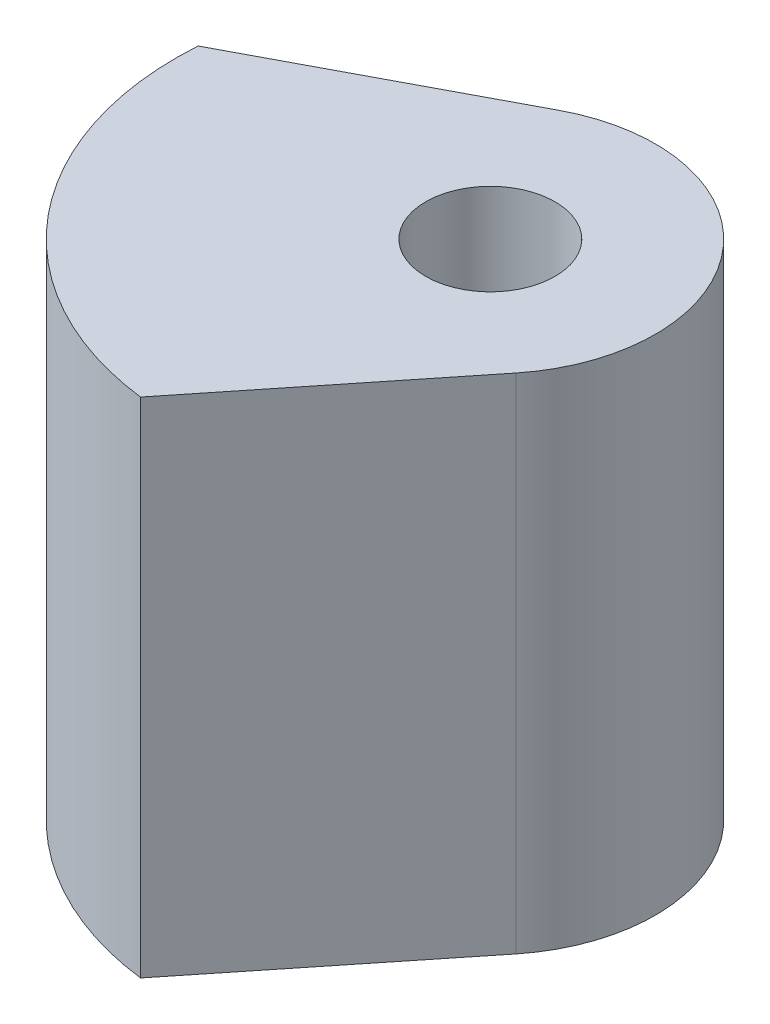
ISO-10303-21;
HEADER;
FILE_DESCRIPTION(('STEP AP214'),'2;1');
FILE_NAME('part.step','',(''),(''),'','','');
FILE_SCHEMA(('AUTOMOTIVE_DESIGN { 1 0 10303 214 1 1 1 1 }'));
ENDSEC;
DATA;
#1=APPLICATION_CONTEXT('core data for automotive mechanical design processes');
#2=APPLICATION_PROTOCOL_DEFINITION('international standard','automotive_design',2000,#1);
#3=PRODUCT_CONTEXT('',#1,'mechanical');
#4=PRODUCT('Part','Part','',(#3));
#5=PRODUCT_RELATED_PRODUCT_CATEGORY('part','',(#4));
#6=PRODUCT_DEFINITION_FORMATION('','',#4);
#7=PRODUCT_DEFINITION_CONTEXT('part definition',#1,'design');
#8=PRODUCT_DEFINITION('design','',#6,#7);
#9=PRODUCT_DEFINITION_SHAPE('','',#8);
#10=(LENGTH_UNIT() NAMED_UNIT(*) SI_UNIT(.MILLI.,.METRE.));
#11=(NAMED_UNIT(*) PLANE_ANGLE_UNIT() SI_UNIT($,.RADIAN.));
#12=(NAMED_UNIT(*) SI_UNIT($,.STERADIAN.) SOLID_ANGLE_UNIT());
#13=UNCERTAINTY_MEASURE_WITH_UNIT(LENGTH_MEASURE(1.E-05),#10,'distance_accuracy_value','');
#14=(GEOMETRIC_REPRESENTATION_CONTEXT(3) GLOBAL_UNCERTAINTY_ASSIGNED_CONTEXT((#13)) GLOBAL_UNIT_ASSIGNED_CONTEXT((#10,
#11,#12)) REPRESENTATION_CONTEXT('',''));
#15=CARTESIAN_POINT('',(0.,0.,0.));
#16=DIRECTION('',(0.,0.,1.));
#17=DIRECTION('',(1.,0.,0.));
#18=AXIS2_PLACEMENT_3D('',#15,#16,#17);
#19=CARTESIAN_POINT('',(-3.02691739141013,6.,0.615971894933232));
#20=DIRECTION('',(0.,1.,0.));
#21=DIRECTION('',(0.,0.,1.));
#22=AXIS2_PLACEMENT_3D('',#19,#20,#21);
#23=PLANE('',#22);
#24=CARTESIAN_POINT('',(-3.02691739141013,6.,0.615971894933232));
#25=DIRECTION('',(0.,1.,0.));
#26=DIRECTION('',(0.,0.,1.));
#27=AXIS2_PLACEMENT_3D('',#24,#25,#26);
#28=CIRCLE('',#27,1.96784902839059);
#29=CARTESIAN_POINT('',(-1.49051334675785,6.,1.84556223732939));
#30=VERTEX_POINT('',#29);
#31=CARTESIAN_POINT('',(-3.94609306967338,6.,-1.12401255069469));
#32=VERTEX_POINT('',#31);
#33=EDGE_CURVE('E85',#30,#32,#28,.T.);
#34=ORIENTED_EDGE('',*,*,#33,.T.);
#35=DIRECTION('',(-0.884206268125643,0.,0.467096644611502));
#36=VECTOR('',#35,1.);
#37=CARTESIAN_POINT('',(-3.94609306967338,6.,-1.12401255069469));
#38=LINE('',#37,#36);
#39=CARTESIAN_POINT('',(-6.76341973663373,6.,0.364287046752516));
#40=VERTEX_POINT('',#39);
#41=EDGE_CURVE('E80',#32,#40,#38,.T.);
#42=ORIENTED_EDGE('',*,*,#41,.T.);
#43=CARTESIAN_POINT('',(-3.02691739141013,6.,0.615971894933232));
#44=DIRECTION('',(0.,1.,0.));
#45=DIRECTION('',(0.,0.,1.));
#46=AXIS2_PLACEMENT_3D('',#43,#44,#45);
#47=CIRCLE('',#46,3.74496929742625);
#48=CARTESIAN_POINT('',(-3.4814263516264,6.,4.3332580883475));
#49=VERTEX_POINT('',#48);
#50=EDGE_CURVE('E83',#40,#49,#47,.T.);
#51=ORIENTED_EDGE('',*,*,#50,.T.);
#52=DIRECTION('',(0.624839774117115,0.,-0.780753006194195));
#53=VECTOR('',#52,1.);
#54=CARTESIAN_POINT('',(-3.4814263516264,6.,4.3332580883475));
#55=LINE('',#54,#53);
#56=EDGE_CURVE('E50',#49,#30,#55,.T.);
#57=ORIENTED_EDGE('',*,*,#56,.T.);
#58=EDGE_LOOP('',(#34,#42,#51,#57));
#59=FACE_BOUND('',#58,.T.);
#60=CARTESIAN_POINT('',(-3.02691739141013,6.,0.615971894933232));
#61=DIRECTION('',(0.,1.,0.));
#62=DIRECTION('',(0.,0.,1.));
#63=AXIS2_PLACEMENT_3D('',#60,#61,#62);
#64=CIRCLE('',#63,0.771298826893348);
#65=CARTESIAN_POINT('',(-3.02691739141013,6.,1.38727072182658));
#66=VERTEX_POINT('',#65);
#67=EDGE_CURVE('E100',#66,#66,#64,.T.);
#68=ORIENTED_EDGE('',*,*,#67,.F.);
#69=EDGE_LOOP('',(#68));
#70=FACE_BOUND('',#69,.T.);
#71=ADVANCED_FACE('F33',(#59,#70),#23,.T.);
#72=CARTESIAN_POINT('',(-3.02691739141013,0.,0.615971894933232));
#73=DIRECTION('',(0.,1.,0.));
#74=DIRECTION('',(0.,0.,1.));
#75=AXIS2_PLACEMENT_3D('',#72,#73,#74);
#76=PLANE('',#75);
#77=CARTESIAN_POINT('',(-3.02691739141013,0.,0.615971894933232));
#78=DIRECTION('',(0.,1.,0.));
#79=DIRECTION('',(0.,0.,1.));
#80=AXIS2_PLACEMENT_3D('',#77,#78,#79);
#81=CIRCLE('',#80,1.96784902839059);
#82=CARTESIAN_POINT('',(-1.49051334675785,0.,1.84556223732939));
#83=VERTEX_POINT('',#82);
#84=CARTESIAN_POINT('',(-3.94609306967338,0.,-1.12401255069469));
#85=VERTEX_POINT('',#84);
#86=EDGE_CURVE('E97',#83,#85,#81,.T.);
#87=ORIENTED_EDGE('',*,*,#86,.F.);
#88=DIRECTION('',(0.624839774117115,0.,-0.780753006194195));
#89=VECTOR('',#88,1.);
#90=CARTESIAN_POINT('',(-3.4814263516264,0.,4.3332580883475));
#91=LINE('',#90,#89);
#92=CARTESIAN_POINT('',(-3.4814263516264,0.,4.3332580883475));
#93=VERTEX_POINT('',#92);
#94=EDGE_CURVE('E73',#93,#83,#91,.T.);
#95=ORIENTED_EDGE('',*,*,#94,.F.);
#96=CARTESIAN_POINT('',(-3.02691739141013,0.,0.615971894933232));
#97=DIRECTION('',(0.,1.,0.));
#98=DIRECTION('',(0.,0.,1.));
#99=AXIS2_PLACEMENT_3D('',#96,#97,#98);
#100=CIRCLE('',#99,3.74496929742625);
#101=CARTESIAN_POINT('',(-6.76341973663373,0.,0.364287046752516));
#102=VERTEX_POINT('',#101);
#103=EDGE_CURVE('E67',#102,#93,#100,.T.);
#104=ORIENTED_EDGE('',*,*,#103,.F.);
#105=DIRECTION('',(-0.884206268125643,0.,0.467096644611502));
#106=VECTOR('',#105,1.);
#107=CARTESIAN_POINT('',(-3.94609306967338,0.,-1.12401255069469));
#108=LINE('',#107,#106);
#109=EDGE_CURVE('E89',#85,#102,#108,.T.);
#110=ORIENTED_EDGE('',*,*,#109,.F.);
#111=EDGE_LOOP('',(#87,#95,#104,#110));
#112=FACE_BOUND('',#111,.T.);
#113=CARTESIAN_POINT('',(-3.02691739141013,0.,0.615971894933232));
#114=DIRECTION('',(0.,1.,0.));
#115=DIRECTION('',(0.,0.,1.));
#116=AXIS2_PLACEMENT_3D('',#113,#114,#115);
#117=CIRCLE('',#116,0.771298826893348);
#118=CARTESIAN_POINT('',(-3.02691739141013,0.,1.38727072182658));
#119=VERTEX_POINT('',#118);
#120=EDGE_CURVE('E112',#119,#119,#117,.T.);
#121=ORIENTED_EDGE('',*,*,#120,.T.);
#122=EDGE_LOOP('',(#121));
#123=FACE_BOUND('',#122,.T.);
#124=ADVANCED_FACE('F108',(#112,#123),#76,.F.);
#125=CARTESIAN_POINT('',(-3.02691739141013,6.,0.615971894933232));
#126=DIRECTION('',(0.,-1.,0.));
#127=DIRECTION('',(0.,0.,-1.));
#128=AXIS2_PLACEMENT_3D('',#125,#126,#127);
#129=CYLINDRICAL_SURFACE('',#128,1.96784902839059);
#130=ORIENTED_EDGE('',*,*,#86,.T.);
#131=DIRECTION('',(0.,-1.,0.));
#132=VECTOR('',#131,1.);
#133=CARTESIAN_POINT('',(-3.94609306967338,6.,-1.12401255069469));
#134=LINE('',#133,#132);
#135=EDGE_CURVE('E11',#32,#85,#134,.T.);
#136=ORIENTED_EDGE('',*,*,#135,.F.);
#137=ORIENTED_EDGE('',*,*,#33,.F.);
#138=DIRECTION('',(0.,-1.,0.));
#139=VECTOR('',#138,1.);
#140=CARTESIAN_POINT('',(-1.49051334675785,6.,1.84556223732939));
#141=LINE('',#140,#139);
#142=EDGE_CURVE('E93',#30,#83,#141,.T.);
#143=ORIENTED_EDGE('',*,*,#142,.T.);
#144=EDGE_LOOP('',(#130,#136,#137,#143));
#145=FACE_BOUND('',#144,.T.);
#146=ADVANCED_FACE('F35',(#145),#129,.T.);
#147=CARTESIAN_POINT('',(-3.94609306967338,6.,-1.12401255069469));
#148=DIRECTION('',(0.467096644611502,0.,0.884206268125643));
#149=DIRECTION('',(0.884206268125643,0.,-0.467096644611502));
#150=AXIS2_PLACEMENT_3D('',#147,#148,#149);
#151=PLANE('',#150);
#152=ORIENTED_EDGE('',*,*,#109,.T.);
#153=DIRECTION('',(0.,-1.,0.));
#154=VECTOR('',#153,1.);
#155=CARTESIAN_POINT('',(-6.76341973663373,6.,0.364287046752516));
#156=LINE('',#155,#154);
#157=EDGE_CURVE('E42',#40,#102,#156,.T.);
#158=ORIENTED_EDGE('',*,*,#157,.F.);
#159=ORIENTED_EDGE('',*,*,#41,.F.);
#160=ORIENTED_EDGE('',*,*,#135,.T.);
#161=EDGE_LOOP('',(#152,#158,#159,#160));
#162=FACE_BOUND('',#161,.T.);
#163=ADVANCED_FACE('F88',(#162),#151,.F.);
#164=CARTESIAN_POINT('',(-3.02691739141013,6.,0.615971894933232));
#165=DIRECTION('',(0.,-1.,0.));
#166=DIRECTION('',(0.,0.,-1.));
#167=AXIS2_PLACEMENT_3D('',#164,#165,#166);
#168=CYLINDRICAL_SURFACE('',#167,3.74496929742625);
#169=ORIENTED_EDGE('',*,*,#103,.T.);
#170=DIRECTION('',(0.,-1.,0.));
#171=VECTOR('',#170,1.);
#172=CARTESIAN_POINT('',(-3.4814263516264,6.,4.3332580883475));
#173=LINE('',#172,#171);
#174=EDGE_CURVE('E90',#49,#93,#173,.T.);
#175=ORIENTED_EDGE('',*,*,#174,.F.);
#176=ORIENTED_EDGE('',*,*,#50,.F.);
#177=ORIENTED_EDGE('',*,*,#157,.T.);
#178=EDGE_LOOP('',(#169,#175,#176,#177));
#179=FACE_BOUND('',#178,.T.);
#180=ADVANCED_FACE('F91',(#179),#168,.T.);
#181=CARTESIAN_POINT('',(-3.4814263516264,6.,4.3332580883475));
#182=DIRECTION('',(-0.780753006194195,0.,-0.624839774117115));
#183=DIRECTION('',(-0.624839774117115,0.,0.780753006194195));
#184=AXIS2_PLACEMENT_3D('',#181,#182,#183);
#185=PLANE('',#184);
#186=ORIENTED_EDGE('',*,*,#94,.T.);
#187=ORIENTED_EDGE('',*,*,#142,.F.);
#188=ORIENTED_EDGE('',*,*,#56,.F.);
#189=ORIENTED_EDGE('',*,*,#174,.T.);
#190=EDGE_LOOP('',(#186,#187,#188,#189));
#191=FACE_BOUND('',#190,.T.);
#192=ADVANCED_FACE('F105',(#191),#185,.F.);
#193=CARTESIAN_POINT('',(-3.02691739141013,6.,0.615971894933232));
#194=DIRECTION('',(0.,-1.,0.));
#195=DIRECTION('',(0.,0.,-1.));
#196=AXIS2_PLACEMENT_3D('',#193,#194,#195);
#197=CYLINDRICAL_SURFACE('',#196,0.771298826893348);
#198=ORIENTED_EDGE('',*,*,#67,.T.);
#199=EDGE_LOOP('',(#198));
#200=FACE_BOUND('',#199,.T.);
#201=ORIENTED_EDGE('',*,*,#120,.F.);
#202=EDGE_LOOP('',(#201));
#203=FACE_BOUND('',#202,.T.);
#204=ADVANCED_FACE('F118',(#200,#203),#197,.F.);
#205=CLOSED_SHELL('',(#71,#124,#146,#163,#180,#192,#204));
#206=MANIFOLD_SOLID_BREP('B2',#205);
#207=ADVANCED_BREP_SHAPE_REPRESENTATION('',(#18,#206),#14);
#208=SHAPE_DEFINITION_REPRESENTATION(#9,#207);
ENDSEC;
END-ISO-10303-21;
